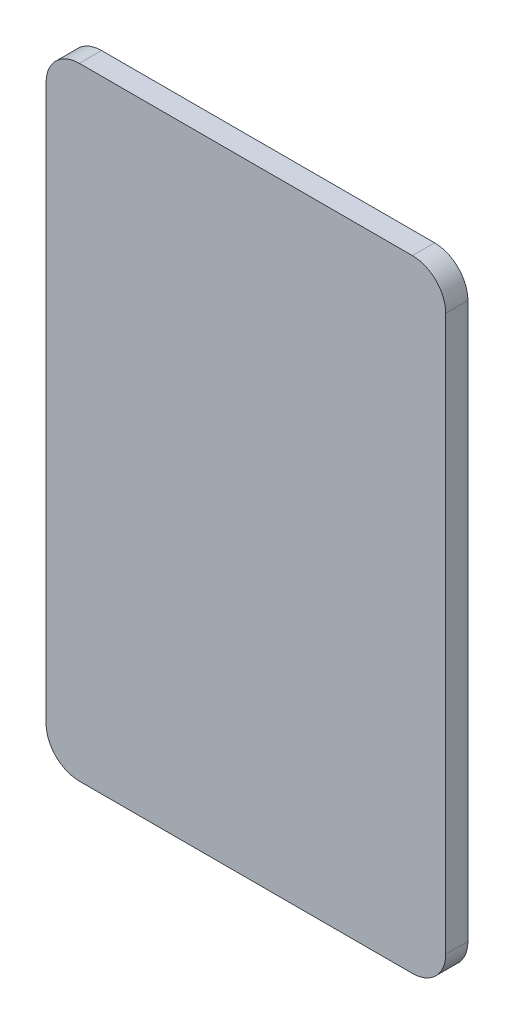
ISO-10303-21;
HEADER;
FILE_DESCRIPTION(('STEP AP214'),'2;1');
FILE_NAME('part.step','',(''),(''),'','','');
FILE_SCHEMA(('AUTOMOTIVE_DESIGN { 1 0 10303 214 1 1 1 1 }'));
ENDSEC;
DATA;
#1=APPLICATION_CONTEXT('core data for automotive mechanical design processes');
#2=APPLICATION_PROTOCOL_DEFINITION('international standard','automotive_design',2000,#1);
#3=PRODUCT_CONTEXT('',#1,'mechanical');
#4=PRODUCT('Part','Part','',(#3));
#5=PRODUCT_RELATED_PRODUCT_CATEGORY('part','',(#4));
#6=PRODUCT_DEFINITION_FORMATION('','',#4);
#7=PRODUCT_DEFINITION_CONTEXT('part definition',#1,'design');
#8=PRODUCT_DEFINITION('design','',#6,#7);
#9=PRODUCT_DEFINITION_SHAPE('','',#8);
#10=(LENGTH_UNIT() NAMED_UNIT(*) SI_UNIT(.MILLI.,.METRE.));
#11=(NAMED_UNIT(*) PLANE_ANGLE_UNIT() SI_UNIT($,.RADIAN.));
#12=(NAMED_UNIT(*) SI_UNIT($,.STERADIAN.) SOLID_ANGLE_UNIT());
#13=UNCERTAINTY_MEASURE_WITH_UNIT(LENGTH_MEASURE(1.E-05),#10,'distance_accuracy_value','');
#14=(GEOMETRIC_REPRESENTATION_CONTEXT(3) GLOBAL_UNCERTAINTY_ASSIGNED_CONTEXT((#13)) GLOBAL_UNIT_ASSIGNED_CONTEXT((#10,
#11,#12)) REPRESENTATION_CONTEXT('',''));
#15=CARTESIAN_POINT('',(0.,0.,0.));
#16=DIRECTION('',(0.,0.,1.));
#17=DIRECTION('',(1.,0.,0.));
#18=AXIS2_PLACEMENT_3D('',#15,#16,#17);
#19=CARTESIAN_POINT('',(-150.,-250.,20.));
#20=DIRECTION('',(0.,0.,-1.));
#21=DIRECTION('',(-1.,0.,0.));
#22=AXIS2_PLACEMENT_3D('',#19,#20,#21);
#23=CYLINDRICAL_SURFACE('',#22,29.9999999999999);
#24=CARTESIAN_POINT('',(-150.,-250.,0.));
#25=DIRECTION('',(0.,0.,1.));
#26=DIRECTION('',(-1.,0.,0.));
#27=AXIS2_PLACEMENT_3D('',#24,#25,#26);
#28=CIRCLE('',#27,29.9999999999999);
#29=CARTESIAN_POINT('',(-180.,-250.,0.));
#30=VERTEX_POINT('',#29);
#31=CARTESIAN_POINT('',(-150.,-280.,0.));
#32=VERTEX_POINT('',#31);
#33=EDGE_CURVE('E128',#30,#32,#28,.T.);
#34=ORIENTED_EDGE('',*,*,#33,.T.);
#35=DIRECTION('',(0.,0.,-1.));
#36=VECTOR('',#35,1.);
#37=CARTESIAN_POINT('',(-150.,-280.,20.));
#38=LINE('',#37,#36);
#39=CARTESIAN_POINT('',(-150.,-280.,20.));
#40=VERTEX_POINT('',#39);
#41=EDGE_CURVE('E11',#40,#32,#38,.T.);
#42=ORIENTED_EDGE('',*,*,#41,.F.);
#43=CARTESIAN_POINT('',(-150.,-250.,20.));
#44=DIRECTION('',(0.,0.,1.));
#45=DIRECTION('',(-1.,0.,0.));
#46=AXIS2_PLACEMENT_3D('',#43,#44,#45);
#47=CIRCLE('',#46,29.9999999999999);
#48=CARTESIAN_POINT('',(-180.,-250.,20.));
#49=VERTEX_POINT('',#48);
#50=EDGE_CURVE('E142',#49,#40,#47,.T.);
#51=ORIENTED_EDGE('',*,*,#50,.F.);
#52=DIRECTION('',(0.,0.,-1.));
#53=VECTOR('',#52,1.);
#54=CARTESIAN_POINT('',(-180.,-250.,20.));
#55=LINE('',#54,#53);
#56=EDGE_CURVE('E124',#49,#30,#55,.T.);
#57=ORIENTED_EDGE('',*,*,#56,.T.);
#58=EDGE_LOOP('',(#34,#42,#51,#57));
#59=FACE_BOUND('',#58,.T.);
#60=ADVANCED_FACE('F32',(#59),#23,.T.);
#61=CARTESIAN_POINT('',(-150.,-280.,20.));
#62=DIRECTION('',(0.,1.,0.));
#63=DIRECTION('',(-1.,0.,0.));
#64=AXIS2_PLACEMENT_3D('',#61,#62,#63);
#65=PLANE('',#64);
#66=DIRECTION('',(1.,0.,0.));
#67=VECTOR('',#66,1.);
#68=CARTESIAN_POINT('',(-150.,-280.,0.));
#69=LINE('',#68,#67);
#70=CARTESIAN_POINT('',(150.,-280.,0.));
#71=VERTEX_POINT('',#70);
#72=EDGE_CURVE('E131',#32,#71,#69,.T.);
#73=ORIENTED_EDGE('',*,*,#72,.T.);
#74=DIRECTION('',(0.,0.,-1.));
#75=VECTOR('',#74,1.);
#76=CARTESIAN_POINT('',(150.,-280.,20.));
#77=LINE('',#76,#75);
#78=CARTESIAN_POINT('',(150.,-280.,20.));
#79=VERTEX_POINT('',#78);
#80=EDGE_CURVE('E40',#79,#71,#77,.T.);
#81=ORIENTED_EDGE('',*,*,#80,.F.);
#82=DIRECTION('',(1.,0.,0.));
#83=VECTOR('',#82,1.);
#84=CARTESIAN_POINT('',(-150.,-280.,20.));
#85=LINE('',#84,#83);
#86=EDGE_CURVE('E91',#40,#79,#85,.T.);
#87=ORIENTED_EDGE('',*,*,#86,.F.);
#88=ORIENTED_EDGE('',*,*,#41,.T.);
#89=EDGE_LOOP('',(#73,#81,#87,#88));
#90=FACE_BOUND('',#89,.T.);
#91=ADVANCED_FACE('F177',(#90),#65,.F.);
#92=CARTESIAN_POINT('',(150.,-250.,20.));
#93=DIRECTION('',(0.,0.,-1.));
#94=DIRECTION('',(-1.,0.,0.));
#95=AXIS2_PLACEMENT_3D('',#92,#93,#94);
#96=CYLINDRICAL_SURFACE('',#95,30.0000000000001);
#97=CARTESIAN_POINT('',(150.,-250.,0.));
#98=DIRECTION('',(0.,0.,1.));
#99=DIRECTION('',(1.,0.,0.));
#100=AXIS2_PLACEMENT_3D('',#97,#98,#99);
#101=CIRCLE('',#100,30.0000000000001);
#102=CARTESIAN_POINT('',(180.,-250.,0.));
#103=VERTEX_POINT('',#102);
#104=EDGE_CURVE('E133',#71,#103,#101,.T.);
#105=ORIENTED_EDGE('',*,*,#104,.T.);
#106=DIRECTION('',(0.,0.,-1.));
#107=VECTOR('',#106,1.);
#108=CARTESIAN_POINT('',(180.,-250.,20.));
#109=LINE('',#108,#107);
#110=CARTESIAN_POINT('',(180.,-250.,20.));
#111=VERTEX_POINT('',#110);
#112=EDGE_CURVE('E149',#111,#103,#109,.T.);
#113=ORIENTED_EDGE('',*,*,#112,.F.);
#114=CARTESIAN_POINT('',(150.,-250.,20.));
#115=DIRECTION('',(0.,0.,1.));
#116=DIRECTION('',(1.,0.,0.));
#117=AXIS2_PLACEMENT_3D('',#114,#115,#116);
#118=CIRCLE('',#117,30.0000000000001);
#119=EDGE_CURVE('E157',#79,#111,#118,.T.);
#120=ORIENTED_EDGE('',*,*,#119,.F.);
#121=ORIENTED_EDGE('',*,*,#80,.T.);
#122=EDGE_LOOP('',(#105,#113,#120,#121));
#123=FACE_BOUND('',#122,.T.);
#124=ADVANCED_FACE('F155',(#123),#96,.T.);
#125=CARTESIAN_POINT('',(180.,-250.,20.));
#126=DIRECTION('',(-1.,0.,0.));
#127=DIRECTION('',(0.,0.,1.));
#128=AXIS2_PLACEMENT_3D('',#125,#126,#127);
#129=PLANE('',#128);
#130=DIRECTION('',(0.,1.,0.));
#131=VECTOR('',#130,1.);
#132=CARTESIAN_POINT('',(180.,-250.,0.));
#133=LINE('',#132,#131);
#134=CARTESIAN_POINT('',(180.,250.,0.));
#135=VERTEX_POINT('',#134);
#136=EDGE_CURVE('E135',#103,#135,#133,.T.);
#137=ORIENTED_EDGE('',*,*,#136,.T.);
#138=DIRECTION('',(0.,0.,-1.));
#139=VECTOR('',#138,1.);
#140=CARTESIAN_POINT('',(180.,250.,20.));
#141=LINE('',#140,#139);
#142=CARTESIAN_POINT('',(180.,250.,20.));
#143=VERTEX_POINT('',#142);
#144=EDGE_CURVE('E146',#143,#135,#141,.T.);
#145=ORIENTED_EDGE('',*,*,#144,.F.);
#146=DIRECTION('',(0.,1.,0.));
#147=VECTOR('',#146,1.);
#148=CARTESIAN_POINT('',(180.,-250.,20.));
#149=LINE('',#148,#147);
#150=EDGE_CURVE('E169',#111,#143,#149,.T.);
#151=ORIENTED_EDGE('',*,*,#150,.F.);
#152=ORIENTED_EDGE('',*,*,#112,.T.);
#153=EDGE_LOOP('',(#137,#145,#151,#152));
#154=FACE_BOUND('',#153,.T.);
#155=ADVANCED_FACE('F165',(#154),#129,.F.);
#156=CARTESIAN_POINT('',(150.,250.,20.));
#157=DIRECTION('',(0.,0.,-1.));
#158=DIRECTION('',(-1.,0.,0.));
#159=AXIS2_PLACEMENT_3D('',#156,#157,#158);
#160=CYLINDRICAL_SURFACE('',#159,30.0000000000001);
#161=CARTESIAN_POINT('',(150.,250.,0.));
#162=DIRECTION('',(0.,0.,1.));
#163=DIRECTION('',(-1.,0.,0.));
#164=AXIS2_PLACEMENT_3D('',#161,#162,#163);
#165=CIRCLE('',#164,30.0000000000001);
#166=CARTESIAN_POINT('',(150.,280.,0.));
#167=VERTEX_POINT('',#166);
#168=EDGE_CURVE('E137',#135,#167,#165,.T.);
#169=ORIENTED_EDGE('',*,*,#168,.T.);
#170=DIRECTION('',(0.,0.,-1.));
#171=VECTOR('',#170,1.);
#172=CARTESIAN_POINT('',(150.,280.,20.));
#173=LINE('',#172,#171);
#174=CARTESIAN_POINT('',(150.,280.,20.));
#175=VERTEX_POINT('',#174);
#176=EDGE_CURVE('E119',#175,#167,#173,.T.);
#177=ORIENTED_EDGE('',*,*,#176,.F.);
#178=CARTESIAN_POINT('',(150.,250.,20.));
#179=DIRECTION('',(0.,0.,1.));
#180=DIRECTION('',(-1.,0.,0.));
#181=AXIS2_PLACEMENT_3D('',#178,#179,#180);
#182=CIRCLE('',#181,30.0000000000001);
#183=EDGE_CURVE('E110',#143,#175,#182,.T.);
#184=ORIENTED_EDGE('',*,*,#183,.F.);
#185=ORIENTED_EDGE('',*,*,#144,.T.);
#186=EDGE_LOOP('',(#169,#177,#184,#185));
#187=FACE_BOUND('',#186,.T.);
#188=ADVANCED_FACE('F168',(#187),#160,.T.);
#189=CARTESIAN_POINT('',(-150.,280.,20.));
#190=DIRECTION('',(0.,-1.,0.));
#191=DIRECTION('',(1.,0.,0.));
#192=AXIS2_PLACEMENT_3D('',#189,#190,#191);
#193=PLANE('',#192);
#194=DIRECTION('',(-1.,0.,0.));
#195=VECTOR('',#194,1.);
#196=CARTESIAN_POINT('',(-150.,280.,0.));
#197=LINE('',#196,#195);
#198=CARTESIAN_POINT('',(-150.,280.,0.));
#199=VERTEX_POINT('',#198);
#200=EDGE_CURVE('E118',#167,#199,#197,.T.);
#201=ORIENTED_EDGE('',*,*,#200,.T.);
#202=DIRECTION('',(0.,0.,-1.));
#203=VECTOR('',#202,1.);
#204=CARTESIAN_POINT('',(-150.,280.,20.));
#205=LINE('',#204,#203);
#206=CARTESIAN_POINT('',(-150.,280.,20.));
#207=VERTEX_POINT('',#206);
#208=EDGE_CURVE('E115',#207,#199,#205,.T.);
#209=ORIENTED_EDGE('',*,*,#208,.F.);
#210=DIRECTION('',(-1.,0.,0.));
#211=VECTOR('',#210,1.);
#212=CARTESIAN_POINT('',(-150.,280.,20.));
#213=LINE('',#212,#211);
#214=EDGE_CURVE('E104',#175,#207,#213,.T.);
#215=ORIENTED_EDGE('',*,*,#214,.F.);
#216=ORIENTED_EDGE('',*,*,#176,.T.);
#217=EDGE_LOOP('',(#201,#209,#215,#216));
#218=FACE_BOUND('',#217,.T.);
#219=ADVANCED_FACE('F116',(#218),#193,.F.);
#220=CARTESIAN_POINT('',(-150.,250.,20.));
#221=DIRECTION('',(0.,0.,-1.));
#222=DIRECTION('',(-1.,0.,0.));
#223=AXIS2_PLACEMENT_3D('',#220,#221,#222);
#224=CYLINDRICAL_SURFACE('',#223,29.9999999999999);
#225=CARTESIAN_POINT('',(-150.,250.,0.));
#226=DIRECTION('',(0.,0.,1.));
#227=DIRECTION('',(-1.,0.,0.));
#228=AXIS2_PLACEMENT_3D('',#225,#226,#227);
#229=CIRCLE('',#228,29.9999999999999);
#230=CARTESIAN_POINT('',(-180.,250.,0.));
#231=VERTEX_POINT('',#230);
#232=EDGE_CURVE('E77',#199,#231,#229,.T.);
#233=ORIENTED_EDGE('',*,*,#232,.T.);
#234=DIRECTION('',(0.,0.,-1.));
#235=VECTOR('',#234,1.);
#236=CARTESIAN_POINT('',(-180.,250.,20.));
#237=LINE('',#236,#235);
#238=CARTESIAN_POINT('',(-180.,250.,20.));
#239=VERTEX_POINT('',#238);
#240=EDGE_CURVE('E120',#239,#231,#237,.T.);
#241=ORIENTED_EDGE('',*,*,#240,.F.);
#242=CARTESIAN_POINT('',(-150.,250.,20.));
#243=DIRECTION('',(0.,0.,1.));
#244=DIRECTION('',(-1.,0.,0.));
#245=AXIS2_PLACEMENT_3D('',#242,#243,#244);
#246=CIRCLE('',#245,29.9999999999999);
#247=EDGE_CURVE('E108',#207,#239,#246,.T.);
#248=ORIENTED_EDGE('',*,*,#247,.F.);
#249=ORIENTED_EDGE('',*,*,#208,.T.);
#250=EDGE_LOOP('',(#233,#241,#248,#249));
#251=FACE_BOUND('',#250,.T.);
#252=ADVANCED_FACE('F122',(#251),#224,.T.);
#253=CARTESIAN_POINT('',(-180.,-250.,20.));
#254=DIRECTION('',(1.,0.,0.));
#255=DIRECTION('',(0.,0.,-1.));
#256=AXIS2_PLACEMENT_3D('',#253,#254,#255);
#257=PLANE('',#256);
#258=DIRECTION('',(0.,-1.,0.));
#259=VECTOR('',#258,1.);
#260=CARTESIAN_POINT('',(-180.,-250.,0.));
#261=LINE('',#260,#259);
#262=EDGE_CURVE('E83',#231,#30,#261,.T.);
#263=ORIENTED_EDGE('',*,*,#262,.T.);
#264=ORIENTED_EDGE('',*,*,#56,.F.);
#265=DIRECTION('',(0.,-1.,0.));
#266=VECTOR('',#265,1.);
#267=CARTESIAN_POINT('',(-180.,-250.,20.));
#268=LINE('',#267,#266);
#269=EDGE_CURVE('E48',#239,#49,#268,.T.);
#270=ORIENTED_EDGE('',*,*,#269,.F.);
#271=ORIENTED_EDGE('',*,*,#240,.T.);
#272=EDGE_LOOP('',(#263,#264,#270,#271));
#273=FACE_BOUND('',#272,.T.);
#274=ADVANCED_FACE('F193',(#273),#257,.F.);
#275=CARTESIAN_POINT('',(-150.,-250.,20.));
#276=DIRECTION('',(0.,0.,-1.));
#277=DIRECTION('',(-1.,0.,0.));
#278=AXIS2_PLACEMENT_3D('',#275,#276,#277);
#279=PLANE('',#278);
#280=ORIENTED_EDGE('',*,*,#50,.T.);
#281=ORIENTED_EDGE('',*,*,#86,.T.);
#282=ORIENTED_EDGE('',*,*,#119,.T.);
#283=ORIENTED_EDGE('',*,*,#150,.T.);
#284=ORIENTED_EDGE('',*,*,#183,.T.);
#285=ORIENTED_EDGE('',*,*,#214,.T.);
#286=ORIENTED_EDGE('',*,*,#247,.T.);
#287=ORIENTED_EDGE('',*,*,#269,.T.);
#288=EDGE_LOOP('',(#280,#281,#282,#283,#284,#285,#286,#287));
#289=FACE_BOUND('',#288,.T.);
#290=ADVANCED_FACE('F106',(#289),#279,.F.);
#291=CARTESIAN_POINT('',(-150.,-250.,0.));
#292=DIRECTION('',(0.,0.,-1.));
#293=DIRECTION('',(-1.,0.,0.));
#294=AXIS2_PLACEMENT_3D('',#291,#292,#293);
#295=PLANE('',#294);
#296=ORIENTED_EDGE('',*,*,#33,.F.);
#297=ORIENTED_EDGE('',*,*,#262,.F.);
#298=ORIENTED_EDGE('',*,*,#232,.F.);
#299=ORIENTED_EDGE('',*,*,#200,.F.);
#300=ORIENTED_EDGE('',*,*,#168,.F.);
#301=ORIENTED_EDGE('',*,*,#136,.F.);
#302=ORIENTED_EDGE('',*,*,#104,.F.);
#303=ORIENTED_EDGE('',*,*,#72,.F.);
#304=EDGE_LOOP('',(#296,#297,#298,#299,#300,#301,#302,#303));
#305=FACE_BOUND('',#304,.T.);
#306=ADVANCED_FACE('F161',(#305),#295,.T.);
#307=CLOSED_SHELL('',(#60,#91,#124,#155,#188,#219,#252,#274,#290,#306));
#308=MANIFOLD_SOLID_BREP('B2',#307);
#309=ADVANCED_BREP_SHAPE_REPRESENTATION('',(#18,#308),#14);
#310=SHAPE_DEFINITION_REPRESENTATION(#9,#309);
ENDSEC;
END-ISO-10303-21;
